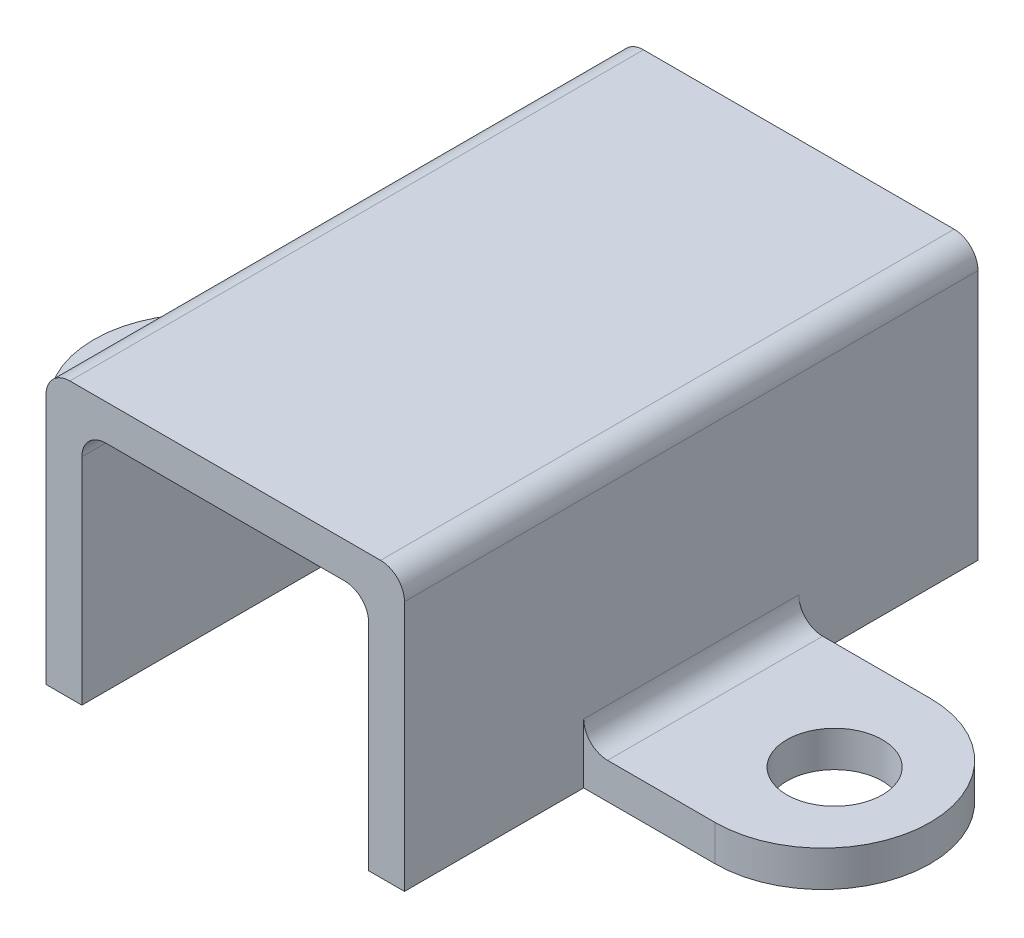
ISO-10303-21;
HEADER;
FILE_DESCRIPTION(('STEP AP214'),'2;1');
FILE_NAME('part.step','',(''),(''),'','','');
FILE_SCHEMA(('AUTOMOTIVE_DESIGN { 1 0 10303 214 1 1 1 1 }'));
ENDSEC;
DATA;
#1=APPLICATION_CONTEXT('core data for automotive mechanical design processes');
#2=APPLICATION_PROTOCOL_DEFINITION('international standard','automotive_design',2000,#1);
#3=PRODUCT_CONTEXT('',#1,'mechanical');
#4=PRODUCT('Part','Part','',(#3));
#5=PRODUCT_RELATED_PRODUCT_CATEGORY('part','',(#4));
#6=PRODUCT_DEFINITION_FORMATION('','',#4);
#7=PRODUCT_DEFINITION_CONTEXT('part definition',#1,'design');
#8=PRODUCT_DEFINITION('design','',#6,#7);
#9=PRODUCT_DEFINITION_SHAPE('','',#8);
#10=(LENGTH_UNIT() NAMED_UNIT(*) SI_UNIT(.MILLI.,.METRE.));
#11=(NAMED_UNIT(*) PLANE_ANGLE_UNIT() SI_UNIT($,.RADIAN.));
#12=(NAMED_UNIT(*) SI_UNIT($,.STERADIAN.) SOLID_ANGLE_UNIT());
#13=UNCERTAINTY_MEASURE_WITH_UNIT(LENGTH_MEASURE(1.E-05),#10,'distance_accuracy_value','');
#14=(GEOMETRIC_REPRESENTATION_CONTEXT(3) GLOBAL_UNCERTAINTY_ASSIGNED_CONTEXT((#13)) GLOBAL_UNIT_ASSIGNED_CONTEXT((#10,
#11,#12)) REPRESENTATION_CONTEXT('',''));
#15=CARTESIAN_POINT('',(0.,0.,0.));
#16=DIRECTION('',(0.,0.,1.));
#17=DIRECTION('',(1.,0.,0.));
#18=AXIS2_PLACEMENT_3D('',#15,#16,#17);
#19=CARTESIAN_POINT('',(6.5,-0.999999999999997,12.));
#20=DIRECTION('',(0.,0.,-1.));
#21=DIRECTION('',(-1.,0.,0.));
#22=AXIS2_PLACEMENT_3D('',#19,#20,#21);
#23=CYLINDRICAL_SURFACE('',#22,1.);
#24=DIRECTION('',(0.,0.,-1.));
#25=VECTOR('',#24,1.);
#26=CARTESIAN_POINT('',(6.5,0.,12.));
#27=LINE('',#26,#25);
#28=CARTESIAN_POINT('',(6.5,0.,12.));
#29=VERTEX_POINT('',#28);
#30=CARTESIAN_POINT('',(6.5,0.,-12.));
#31=VERTEX_POINT('',#30);
#32=EDGE_CURVE('E350',#29,#31,#27,.T.);
#33=ORIENTED_EDGE('',*,*,#32,.F.);
#34=CARTESIAN_POINT('',(6.5,-0.999999999999997,12.));
#35=DIRECTION('',(0.,0.,1.));
#36=DIRECTION('',(1.,0.,0.));
#37=AXIS2_PLACEMENT_3D('',#34,#35,#36);
#38=CIRCLE('',#37,1.);
#39=CARTESIAN_POINT('',(7.5,-0.999999999999997,12.));
#40=VERTEX_POINT('',#39);
#41=EDGE_CURVE('E64',#40,#29,#38,.T.);
#42=ORIENTED_EDGE('',*,*,#41,.F.);
#43=DIRECTION('',(0.,0.,-1.));
#44=VECTOR('',#43,1.);
#45=CARTESIAN_POINT('',(7.5,-0.999999999999997,12.));
#46=LINE('',#45,#44);
#47=CARTESIAN_POINT('',(7.5,-0.999999999999997,-12.));
#48=VERTEX_POINT('',#47);
#49=EDGE_CURVE('E353',#48,#40,#46,.F.);
#50=ORIENTED_EDGE('',*,*,#49,.F.);
#51=CARTESIAN_POINT('',(6.5,-0.999999999999997,-12.));
#52=DIRECTION('',(0.,0.,1.));
#53=DIRECTION('',(1.,0.,0.));
#54=AXIS2_PLACEMENT_3D('',#51,#52,#53);
#55=CIRCLE('',#54,1.);
#56=EDGE_CURVE('E12',#31,#48,#55,.F.);
#57=ORIENTED_EDGE('',*,*,#56,.F.);
#58=EDGE_LOOP('',(#33,#42,#50,#57));
#59=FACE_BOUND('',#58,.T.);
#60=ADVANCED_FACE('F57',(#59),#23,.T.);
#61=CARTESIAN_POINT('',(-6.5,-1.,12.));
#62=DIRECTION('',(0.,0.,1.));
#63=DIRECTION('',(1.,0.,0.));
#64=AXIS2_PLACEMENT_3D('',#61,#62,#63);
#65=CYLINDRICAL_SURFACE('',#64,1.);
#66=DIRECTION('',(0.,0.,1.));
#67=VECTOR('',#66,1.);
#68=CARTESIAN_POINT('',(-6.5,0.,12.));
#69=LINE('',#68,#67);
#70=CARTESIAN_POINT('',(-6.5,0.,-12.));
#71=VERTEX_POINT('',#70);
#72=CARTESIAN_POINT('',(-6.5,0.,12.));
#73=VERTEX_POINT('',#72);
#74=EDGE_CURVE('E339',#71,#73,#69,.T.);
#75=ORIENTED_EDGE('',*,*,#74,.F.);
#76=CARTESIAN_POINT('',(-6.5,-1.,-12.));
#77=DIRECTION('',(0.,0.,1.));
#78=DIRECTION('',(1.,0.,0.));
#79=AXIS2_PLACEMENT_3D('',#76,#77,#78);
#80=CIRCLE('',#79,1.);
#81=CARTESIAN_POINT('',(-7.5,-0.999999999999999,-12.));
#82=VERTEX_POINT('',#81);
#83=EDGE_CURVE('E345',#82,#71,#80,.F.);
#84=ORIENTED_EDGE('',*,*,#83,.F.);
#85=DIRECTION('',(0.,0.,1.));
#86=VECTOR('',#85,1.);
#87=CARTESIAN_POINT('',(-7.5,-0.999999999999999,12.));
#88=LINE('',#87,#86);
#89=CARTESIAN_POINT('',(-7.5,-0.999999999999999,12.));
#90=VERTEX_POINT('',#89);
#91=EDGE_CURVE('E342',#90,#82,#88,.F.);
#92=ORIENTED_EDGE('',*,*,#91,.F.);
#93=CARTESIAN_POINT('',(-6.5,-1.,12.));
#94=DIRECTION('',(0.,0.,1.));
#95=DIRECTION('',(1.,0.,0.));
#96=AXIS2_PLACEMENT_3D('',#93,#94,#95);
#97=CIRCLE('',#96,1.);
#98=EDGE_CURVE('E348',#73,#90,#97,.T.);
#99=ORIENTED_EDGE('',*,*,#98,.F.);
#100=EDGE_LOOP('',(#75,#84,#92,#99));
#101=FACE_BOUND('',#100,.T.);
#102=ADVANCED_FACE('F362',(#101),#65,.T.);
#103=CARTESIAN_POINT('',(5.,-2.5,12.));
#104=DIRECTION('',(0.,0.,-1.));
#105=DIRECTION('',(-1.,0.,0.));
#106=AXIS2_PLACEMENT_3D('',#103,#104,#105);
#107=CYLINDRICAL_SURFACE('',#106,1.);
#108=DIRECTION('',(0.,0.,1.));
#109=VECTOR('',#108,1.);
#110=CARTESIAN_POINT('',(5.,-1.5,12.));
#111=LINE('',#110,#109);
#112=CARTESIAN_POINT('',(5.,-1.5,-12.));
#113=VERTEX_POINT('',#112);
#114=CARTESIAN_POINT('',(5.,-1.5,12.));
#115=VERTEX_POINT('',#114);
#116=EDGE_CURVE('E329',#113,#115,#111,.T.);
#117=ORIENTED_EDGE('',*,*,#116,.F.);
#118=CARTESIAN_POINT('',(5.,-2.5,-12.));
#119=DIRECTION('',(0.,0.,1.));
#120=DIRECTION('',(1.,0.,0.));
#121=AXIS2_PLACEMENT_3D('',#118,#119,#120);
#122=CIRCLE('',#121,1.);
#123=CARTESIAN_POINT('',(6.,-2.5,-12.));
#124=VERTEX_POINT('',#123);
#125=EDGE_CURVE('E335',#113,#124,#122,.F.);
#126=ORIENTED_EDGE('',*,*,#125,.T.);
#127=DIRECTION('',(0.,0.,1.));
#128=VECTOR('',#127,1.);
#129=CARTESIAN_POINT('',(6.,-2.5,12.));
#130=LINE('',#129,#128);
#131=CARTESIAN_POINT('',(6.,-2.5,12.));
#132=VERTEX_POINT('',#131);
#133=EDGE_CURVE('E332',#132,#124,#130,.F.);
#134=ORIENTED_EDGE('',*,*,#133,.F.);
#135=CARTESIAN_POINT('',(5.,-2.5,12.));
#136=DIRECTION('',(0.,0.,1.));
#137=DIRECTION('',(1.,0.,0.));
#138=AXIS2_PLACEMENT_3D('',#135,#136,#137);
#139=CIRCLE('',#138,1.);
#140=EDGE_CURVE('E337',#132,#115,#139,.T.);
#141=ORIENTED_EDGE('',*,*,#140,.T.);
#142=EDGE_LOOP('',(#117,#126,#134,#141));
#143=FACE_BOUND('',#142,.T.);
#144=ADVANCED_FACE('F383',(#143),#107,.F.);
#145=CARTESIAN_POINT('',(-5.,-2.5,12.));
#146=DIRECTION('',(0.,0.,-1.));
#147=DIRECTION('',(-1.,0.,0.));
#148=AXIS2_PLACEMENT_3D('',#145,#146,#147);
#149=CYLINDRICAL_SURFACE('',#148,1.);
#150=DIRECTION('',(0.,0.,1.));
#151=VECTOR('',#150,1.);
#152=CARTESIAN_POINT('',(-6.,-2.5,12.));
#153=LINE('',#152,#151);
#154=CARTESIAN_POINT('',(-6.,-2.5,-12.));
#155=VERTEX_POINT('',#154);
#156=CARTESIAN_POINT('',(-6.,-2.5,12.));
#157=VERTEX_POINT('',#156);
#158=EDGE_CURVE('E319',#155,#157,#153,.T.);
#159=ORIENTED_EDGE('',*,*,#158,.F.);
#160=CARTESIAN_POINT('',(-5.,-2.5,-12.));
#161=DIRECTION('',(0.,0.,1.));
#162=DIRECTION('',(1.,0.,0.));
#163=AXIS2_PLACEMENT_3D('',#160,#161,#162);
#164=CIRCLE('',#163,1.);
#165=CARTESIAN_POINT('',(-5.,-1.5,-12.));
#166=VERTEX_POINT('',#165);
#167=EDGE_CURVE('E325',#155,#166,#164,.F.);
#168=ORIENTED_EDGE('',*,*,#167,.T.);
#169=DIRECTION('',(0.,0.,1.));
#170=VECTOR('',#169,1.);
#171=CARTESIAN_POINT('',(-5.,-1.5,12.));
#172=LINE('',#171,#170);
#173=CARTESIAN_POINT('',(-5.,-1.5,12.));
#174=VERTEX_POINT('',#173);
#175=EDGE_CURVE('E322',#174,#166,#172,.F.);
#176=ORIENTED_EDGE('',*,*,#175,.F.);
#177=CARTESIAN_POINT('',(-5.,-2.5,12.));
#178=DIRECTION('',(0.,0.,1.));
#179=DIRECTION('',(1.,0.,0.));
#180=AXIS2_PLACEMENT_3D('',#177,#178,#179);
#181=CIRCLE('',#180,1.);
#182=EDGE_CURVE('E327',#174,#157,#181,.T.);
#183=ORIENTED_EDGE('',*,*,#182,.T.);
#184=EDGE_LOOP('',(#159,#168,#176,#183));
#185=FACE_BOUND('',#184,.T.);
#186=ADVANCED_FACE('F377',(#185),#149,.F.);
#187=CARTESIAN_POINT('',(8.5,-9.,12.));
#188=DIRECTION('',(0.,0.,1.));
#189=DIRECTION('',(1.,0.,0.));
#190=AXIS2_PLACEMENT_3D('',#187,#188,#189);
#191=CYLINDRICAL_SURFACE('',#190,1.);
#192=DIRECTION('',(0.,0.,-1.));
#193=VECTOR('',#192,1.);
#194=CARTESIAN_POINT('',(7.5,-9.,12.));
#195=LINE('',#194,#193);
#196=CARTESIAN_POINT('',(7.5,-9.,4.5));
#197=VERTEX_POINT('',#196);
#198=CARTESIAN_POINT('',(7.5,-9.,-4.5));
#199=VERTEX_POINT('',#198);
#200=EDGE_CURVE('E308',#197,#199,#195,.T.);
#201=ORIENTED_EDGE('',*,*,#200,.F.);
#202=CARTESIAN_POINT('',(8.5,-9.,4.5));
#203=DIRECTION('',(0.,0.,1.));
#204=DIRECTION('',(1.,0.,0.));
#205=AXIS2_PLACEMENT_3D('',#202,#203,#204);
#206=CIRCLE('',#205,1.);
#207=CARTESIAN_POINT('',(8.5,-10.,4.5));
#208=VERTEX_POINT('',#207);
#209=EDGE_CURVE('E314',#197,#208,#206,.T.);
#210=ORIENTED_EDGE('',*,*,#209,.T.);
#211=DIRECTION('',(0.,0.,-1.));
#212=VECTOR('',#211,1.);
#213=CARTESIAN_POINT('',(8.5,-10.,12.));
#214=LINE('',#213,#212);
#215=CARTESIAN_POINT('',(8.5,-10.,-4.5));
#216=VERTEX_POINT('',#215);
#217=EDGE_CURVE('E311',#216,#208,#214,.F.);
#218=ORIENTED_EDGE('',*,*,#217,.F.);
#219=CARTESIAN_POINT('',(8.5,-9.,-4.5));
#220=DIRECTION('',(0.,0.,1.));
#221=DIRECTION('',(1.,0.,0.));
#222=AXIS2_PLACEMENT_3D('',#219,#220,#221);
#223=CIRCLE('',#222,1.);
#224=EDGE_CURVE('E316',#216,#199,#223,.F.);
#225=ORIENTED_EDGE('',*,*,#224,.T.);
#226=EDGE_LOOP('',(#201,#210,#218,#225));
#227=FACE_BOUND('',#226,.T.);
#228=ADVANCED_FACE('F451',(#227),#191,.F.);
#229=CARTESIAN_POINT('',(-8.5,-9.,12.));
#230=DIRECTION('',(0.,0.,-1.));
#231=DIRECTION('',(-1.,0.,0.));
#232=AXIS2_PLACEMENT_3D('',#229,#230,#231);
#233=CYLINDRICAL_SURFACE('',#232,1.);
#234=DIRECTION('',(0.,0.,1.));
#235=VECTOR('',#234,1.);
#236=CARTESIAN_POINT('',(-7.5,-9.,12.));
#237=LINE('',#236,#235);
#238=CARTESIAN_POINT('',(-7.5,-9.,-4.5));
#239=VERTEX_POINT('',#238);
#240=CARTESIAN_POINT('',(-7.5,-9.,4.5));
#241=VERTEX_POINT('',#240);
#242=EDGE_CURVE('E297',#239,#241,#237,.T.);
#243=ORIENTED_EDGE('',*,*,#242,.F.);
#244=CARTESIAN_POINT('',(-8.5,-9.,-4.5));
#245=DIRECTION('',(0.,0.,-1.));
#246=DIRECTION('',(-1.,0.,0.));
#247=AXIS2_PLACEMENT_3D('',#244,#245,#246);
#248=CIRCLE('',#247,1.);
#249=CARTESIAN_POINT('',(-8.5,-10.,-4.5));
#250=VERTEX_POINT('',#249);
#251=EDGE_CURVE('E303',#239,#250,#248,.T.);
#252=ORIENTED_EDGE('',*,*,#251,.T.);
#253=DIRECTION('',(0.,0.,1.));
#254=VECTOR('',#253,1.);
#255=CARTESIAN_POINT('',(-8.5,-10.,12.));
#256=LINE('',#255,#254);
#257=CARTESIAN_POINT('',(-8.5,-10.,4.5));
#258=VERTEX_POINT('',#257);
#259=EDGE_CURVE('E300',#258,#250,#256,.F.);
#260=ORIENTED_EDGE('',*,*,#259,.F.);
#261=CARTESIAN_POINT('',(-8.5,-9.,4.5));
#262=DIRECTION('',(0.,0.,1.));
#263=DIRECTION('',(1.,0.,0.));
#264=AXIS2_PLACEMENT_3D('',#261,#262,#263);
#265=CIRCLE('',#264,1.);
#266=EDGE_CURVE('E305',#258,#241,#265,.T.);
#267=ORIENTED_EDGE('',*,*,#266,.T.);
#268=EDGE_LOOP('',(#243,#252,#260,#267));
#269=FACE_BOUND('',#268,.T.);
#270=ADVANCED_FACE('F475',(#269),#233,.F.);
#271=CARTESIAN_POINT('',(-17.5,-10.,12.));
#272=DIRECTION('',(0.,-1.,0.));
#273=DIRECTION('',(0.,0.,-1.));
#274=AXIS2_PLACEMENT_3D('',#271,#272,#273);
#275=PLANE('',#274);
#276=CARTESIAN_POINT('',(-13.5,-10.,0.));
#277=DIRECTION('',(0.,1.,0.));
#278=DIRECTION('',(0.,0.,1.));
#279=AXIS2_PLACEMENT_3D('',#276,#277,#278);
#280=CIRCLE('',#279,2.);
#281=CARTESIAN_POINT('',(-13.5,-10.,2.));
#282=VERTEX_POINT('',#281);
#283=EDGE_CURVE('E431',#282,#282,#280,.T.);
#284=ORIENTED_EDGE('',*,*,#283,.F.);
#285=EDGE_LOOP('',(#284));
#286=FACE_BOUND('',#285,.T.);
#287=DIRECTION('',(1.,0.,0.));
#288=VECTOR('',#287,1.);
#289=CARTESIAN_POINT('',(0.,-10.,4.5));
#290=LINE('',#289,#288);
#291=CARTESIAN_POINT('',(-13.,-10.,4.5));
#292=VERTEX_POINT('',#291);
#293=EDGE_CURVE('E221',#292,#258,#290,.T.);
#294=ORIENTED_EDGE('',*,*,#293,.T.);
#295=ORIENTED_EDGE('',*,*,#259,.T.);
#296=DIRECTION('',(-1.,0.,0.));
#297=VECTOR('',#296,1.);
#298=CARTESIAN_POINT('',(0.,-10.,-4.5));
#299=LINE('',#298,#297);
#300=CARTESIAN_POINT('',(-13.,-10.,-4.5));
#301=VERTEX_POINT('',#300);
#302=EDGE_CURVE('E244',#250,#301,#299,.T.);
#303=ORIENTED_EDGE('',*,*,#302,.T.);
#304=CARTESIAN_POINT('',(-13.,-10.,0.));
#305=DIRECTION('',(0.,1.,0.));
#306=DIRECTION('',(0.,0.,1.));
#307=AXIS2_PLACEMENT_3D('',#304,#305,#306);
#308=CIRCLE('',#307,4.5);
#309=EDGE_CURVE('E214',#301,#292,#308,.T.);
#310=ORIENTED_EDGE('',*,*,#309,.T.);
#311=EDGE_LOOP('',(#294,#295,#303,#310));
#312=FACE_BOUND('',#311,.T.);
#313=ADVANCED_FACE('F477',(#286,#312),#275,.F.);
#314=CARTESIAN_POINT('',(-17.5,-11.5,12.));
#315=DIRECTION('',(0.,1.,0.));
#316=DIRECTION('',(0.,0.,1.));
#317=AXIS2_PLACEMENT_3D('',#314,#315,#316);
#318=PLANE('',#317);
#319=CARTESIAN_POINT('',(-13.5,-11.5,0.));
#320=DIRECTION('',(0.,1.,0.));
#321=DIRECTION('',(0.,0.,1.));
#322=AXIS2_PLACEMENT_3D('',#319,#320,#321);
#323=CIRCLE('',#322,2.);
#324=CARTESIAN_POINT('',(-13.5,-11.5,2.));
#325=VERTEX_POINT('',#324);
#326=EDGE_CURVE('E233',#325,#325,#323,.T.);
#327=ORIENTED_EDGE('',*,*,#326,.T.);
#328=EDGE_LOOP('',(#327));
#329=FACE_BOUND('',#328,.T.);
#330=DIRECTION('',(1.,0.,0.));
#331=VECTOR('',#330,1.);
#332=CARTESIAN_POINT('',(0.,-11.5,4.5));
#333=LINE('',#332,#331);
#334=CARTESIAN_POINT('',(-13.,-11.5,4.5));
#335=VERTEX_POINT('',#334);
#336=CARTESIAN_POINT('',(-7.5,-11.5,4.5));
#337=VERTEX_POINT('',#336);
#338=EDGE_CURVE('E218',#335,#337,#333,.T.);
#339=ORIENTED_EDGE('',*,*,#338,.F.);
#340=CARTESIAN_POINT('',(-13.,-11.5,0.));
#341=DIRECTION('',(0.,1.,0.));
#342=DIRECTION('',(0.,0.,1.));
#343=AXIS2_PLACEMENT_3D('',#340,#341,#342);
#344=CIRCLE('',#343,4.5);
#345=CARTESIAN_POINT('',(-13.,-11.5,-4.5));
#346=VERTEX_POINT('',#345);
#347=EDGE_CURVE('E202',#346,#335,#344,.T.);
#348=ORIENTED_EDGE('',*,*,#347,.F.);
#349=DIRECTION('',(-1.,0.,0.));
#350=VECTOR('',#349,1.);
#351=CARTESIAN_POINT('',(0.,-11.5,-4.5));
#352=LINE('',#351,#350);
#353=CARTESIAN_POINT('',(-7.5,-11.5,-4.5));
#354=VERTEX_POINT('',#353);
#355=EDGE_CURVE('E241',#354,#346,#352,.T.);
#356=ORIENTED_EDGE('',*,*,#355,.F.);
#357=DIRECTION('',(0.,0.,-1.));
#358=VECTOR('',#357,1.);
#359=CARTESIAN_POINT('',(-7.5,-11.5,0.));
#360=LINE('',#359,#358);
#361=CARTESIAN_POINT('',(-7.5,-11.5,-12.));
#362=VERTEX_POINT('',#361);
#363=EDGE_CURVE('E243',#354,#362,#360,.T.);
#364=ORIENTED_EDGE('',*,*,#363,.T.);
#365=DIRECTION('',(1.,0.,0.));
#366=VECTOR('',#365,1.);
#367=CARTESIAN_POINT('',(-17.5,-11.5,-12.));
#368=LINE('',#367,#366);
#369=CARTESIAN_POINT('',(-6.,-11.5,-12.));
#370=VERTEX_POINT('',#369);
#371=EDGE_CURVE('E280',#362,#370,#368,.T.);
#372=ORIENTED_EDGE('',*,*,#371,.T.);
#373=DIRECTION('',(0.,0.,-1.));
#374=VECTOR('',#373,1.);
#375=CARTESIAN_POINT('',(-6.,-11.5,12.));
#376=LINE('',#375,#374);
#377=CARTESIAN_POINT('',(-6.,-11.5,12.));
#378=VERTEX_POINT('',#377);
#379=EDGE_CURVE('E294',#378,#370,#376,.T.);
#380=ORIENTED_EDGE('',*,*,#379,.F.);
#381=DIRECTION('',(1.,0.,0.));
#382=VECTOR('',#381,1.);
#383=CARTESIAN_POINT('',(-17.5,-11.5,12.));
#384=LINE('',#383,#382);
#385=CARTESIAN_POINT('',(-7.5,-11.5,12.));
#386=VERTEX_POINT('',#385);
#387=EDGE_CURVE('E260',#386,#378,#384,.T.);
#388=ORIENTED_EDGE('',*,*,#387,.F.);
#389=DIRECTION('',(0.,0.,-1.));
#390=VECTOR('',#389,1.);
#391=CARTESIAN_POINT('',(-7.5,-11.5,0.));
#392=LINE('',#391,#390);
#393=EDGE_CURVE('E229',#386,#337,#392,.T.);
#394=ORIENTED_EDGE('',*,*,#393,.T.);
#395=EDGE_LOOP('',(#339,#348,#356,#364,#372,#380,#388,#394));
#396=FACE_BOUND('',#395,.T.);
#397=ADVANCED_FACE('F226',(#329,#396),#318,.F.);
#398=CARTESIAN_POINT('',(7.5,-10.,12.));
#399=DIRECTION('',(0.,-1.,0.));
#400=DIRECTION('',(0.,0.,-1.));
#401=AXIS2_PLACEMENT_3D('',#398,#399,#400);
#402=PLANE('',#401);
#403=CARTESIAN_POINT('',(13.5,-10.,0.));
#404=DIRECTION('',(0.,1.,0.));
#405=DIRECTION('',(0.,0.,1.));
#406=AXIS2_PLACEMENT_3D('',#403,#404,#405);
#407=CIRCLE('',#406,2.);
#408=CARTESIAN_POINT('',(13.5,-10.,2.));
#409=VERTEX_POINT('',#408);
#410=EDGE_CURVE('E437',#409,#409,#407,.T.);
#411=ORIENTED_EDGE('',*,*,#410,.F.);
#412=EDGE_LOOP('',(#411));
#413=FACE_BOUND('',#412,.T.);
#414=DIRECTION('',(1.,0.,0.));
#415=VECTOR('',#414,1.);
#416=CARTESIAN_POINT('',(0.,-10.,-4.5));
#417=LINE('',#416,#415);
#418=CARTESIAN_POINT('',(13.,-10.,-4.5));
#419=VERTEX_POINT('',#418);
#420=EDGE_CURVE('E404',#216,#419,#417,.T.);
#421=ORIENTED_EDGE('',*,*,#420,.F.);
#422=ORIENTED_EDGE('',*,*,#217,.T.);
#423=DIRECTION('',(1.,0.,0.));
#424=VECTOR('',#423,1.);
#425=CARTESIAN_POINT('',(0.,-10.,4.5));
#426=LINE('',#425,#424);
#427=CARTESIAN_POINT('',(13.,-10.,4.5));
#428=VERTEX_POINT('',#427);
#429=EDGE_CURVE('E240',#208,#428,#426,.T.);
#430=ORIENTED_EDGE('',*,*,#429,.T.);
#431=CARTESIAN_POINT('',(13.,-10.,0.));
#432=DIRECTION('',(0.,1.,0.));
#433=DIRECTION('',(0.,0.,1.));
#434=AXIS2_PLACEMENT_3D('',#431,#432,#433);
#435=CIRCLE('',#434,4.5);
#436=EDGE_CURVE('E222',#428,#419,#435,.T.);
#437=ORIENTED_EDGE('',*,*,#436,.T.);
#438=EDGE_LOOP('',(#421,#422,#430,#437));
#439=FACE_BOUND('',#438,.T.);
#440=ADVANCED_FACE('F412',(#413,#439),#402,.F.);
#441=CARTESIAN_POINT('',(6.,-11.5,12.));
#442=DIRECTION('',(0.,1.,0.));
#443=DIRECTION('',(0.,0.,1.));
#444=AXIS2_PLACEMENT_3D('',#441,#442,#443);
#445=PLANE('',#444);
#446=CARTESIAN_POINT('',(13.5,-11.5,0.));
#447=DIRECTION('',(0.,1.,0.));
#448=DIRECTION('',(0.,0.,1.));
#449=AXIS2_PLACEMENT_3D('',#446,#447,#448);
#450=CIRCLE('',#449,2.);
#451=CARTESIAN_POINT('',(13.5,-11.5,2.));
#452=VERTEX_POINT('',#451);
#453=EDGE_CURVE('E434',#452,#452,#450,.T.);
#454=ORIENTED_EDGE('',*,*,#453,.T.);
#455=EDGE_LOOP('',(#454));
#456=FACE_BOUND('',#455,.T.);
#457=DIRECTION('',(1.,0.,0.));
#458=VECTOR('',#457,1.);
#459=CARTESIAN_POINT('',(0.,-11.5,-4.5));
#460=LINE('',#459,#458);
#461=CARTESIAN_POINT('',(7.5,-11.5,-4.5));
#462=VERTEX_POINT('',#461);
#463=CARTESIAN_POINT('',(13.,-11.5,-4.5));
#464=VERTEX_POINT('',#463);
#465=EDGE_CURVE('E440',#462,#464,#460,.T.);
#466=ORIENTED_EDGE('',*,*,#465,.T.);
#467=CARTESIAN_POINT('',(13.,-11.5,0.));
#468=DIRECTION('',(0.,1.,0.));
#469=DIRECTION('',(0.,0.,1.));
#470=AXIS2_PLACEMENT_3D('',#467,#468,#469);
#471=CIRCLE('',#470,4.5);
#472=CARTESIAN_POINT('',(13.,-11.5,4.5));
#473=VERTEX_POINT('',#472);
#474=EDGE_CURVE('E422',#473,#464,#471,.T.);
#475=ORIENTED_EDGE('',*,*,#474,.F.);
#476=DIRECTION('',(1.,0.,0.));
#477=VECTOR('',#476,1.);
#478=CARTESIAN_POINT('',(0.,-11.5,4.5));
#479=LINE('',#478,#477);
#480=CARTESIAN_POINT('',(7.5,-11.5,4.5));
#481=VERTEX_POINT('',#480);
#482=EDGE_CURVE('E401',#481,#473,#479,.T.);
#483=ORIENTED_EDGE('',*,*,#482,.F.);
#484=DIRECTION('',(0.,0.,1.));
#485=VECTOR('',#484,1.);
#486=CARTESIAN_POINT('',(7.5,-11.5,0.));
#487=LINE('',#486,#485);
#488=CARTESIAN_POINT('',(7.5,-11.5,12.));
#489=VERTEX_POINT('',#488);
#490=EDGE_CURVE('E398',#481,#489,#487,.T.);
#491=ORIENTED_EDGE('',*,*,#490,.T.);
#492=DIRECTION('',(1.,0.,0.));
#493=VECTOR('',#492,1.);
#494=CARTESIAN_POINT('',(6.,-11.5,12.));
#495=LINE('',#494,#493);
#496=CARTESIAN_POINT('',(6.,-11.5,12.));
#497=VERTEX_POINT('',#496);
#498=EDGE_CURVE('E270',#497,#489,#495,.T.);
#499=ORIENTED_EDGE('',*,*,#498,.F.);
#500=DIRECTION('',(0.,0.,-1.));
#501=VECTOR('',#500,1.);
#502=CARTESIAN_POINT('',(6.,-11.5,12.));
#503=LINE('',#502,#501);
#504=CARTESIAN_POINT('',(6.,-11.5,-12.));
#505=VERTEX_POINT('',#504);
#506=EDGE_CURVE('E273',#497,#505,#503,.T.);
#507=ORIENTED_EDGE('',*,*,#506,.T.);
#508=DIRECTION('',(1.,0.,0.));
#509=VECTOR('',#508,1.);
#510=CARTESIAN_POINT('',(6.,-11.5,-12.));
#511=LINE('',#510,#509);
#512=CARTESIAN_POINT('',(7.5,-11.5,-12.));
#513=VERTEX_POINT('',#512);
#514=EDGE_CURVE('E256',#505,#513,#511,.T.);
#515=ORIENTED_EDGE('',*,*,#514,.T.);
#516=DIRECTION('',(0.,0.,-1.));
#517=VECTOR('',#516,1.);
#518=CARTESIAN_POINT('',(7.5,-11.5,0.));
#519=LINE('',#518,#517);
#520=EDGE_CURVE('E442',#462,#513,#519,.T.);
#521=ORIENTED_EDGE('',*,*,#520,.F.);
#522=EDGE_LOOP('',(#466,#475,#483,#491,#499,#507,#515,#521));
#523=FACE_BOUND('',#522,.T.);
#524=ADVANCED_FACE('F395',(#456,#523),#445,.F.);
#525=CARTESIAN_POINT('',(0.,-11.5,-4.5));
#526=DIRECTION('',(0.,0.,1.));
#527=DIRECTION('',(1.,0.,0.));
#528=AXIS2_PLACEMENT_3D('',#525,#526,#527);
#529=PLANE('',#528);
#530=DIRECTION('',(0.,1.,0.));
#531=VECTOR('',#530,1.);
#532=CARTESIAN_POINT('',(13.,-11.5,-4.5));
#533=LINE('',#532,#531);
#534=EDGE_CURVE('E223',#464,#419,#533,.T.);
#535=ORIENTED_EDGE('',*,*,#534,.F.);
#536=ORIENTED_EDGE('',*,*,#465,.F.);
#537=DIRECTION('',(0.,1.,0.));
#538=VECTOR('',#537,1.);
#539=CARTESIAN_POINT('',(7.5,-11.5,-4.5));
#540=LINE('',#539,#538);
#541=EDGE_CURVE('E249',#462,#199,#540,.T.);
#542=ORIENTED_EDGE('',*,*,#541,.T.);
#543=ORIENTED_EDGE('',*,*,#224,.F.);
#544=ORIENTED_EDGE('',*,*,#420,.T.);
#545=EDGE_LOOP('',(#535,#536,#542,#543,#544));
#546=FACE_BOUND('',#545,.T.);
#547=ADVANCED_FACE('F447',(#546),#529,.F.);
#548=CARTESIAN_POINT('',(0.,-11.5,-4.5));
#549=DIRECTION('',(0.,0.,-1.));
#550=DIRECTION('',(-1.,0.,0.));
#551=AXIS2_PLACEMENT_3D('',#548,#549,#550);
#552=PLANE('',#551);
#553=ORIENTED_EDGE('',*,*,#355,.T.);
#554=DIRECTION('',(0.,1.,0.));
#555=VECTOR('',#554,1.);
#556=CARTESIAN_POINT('',(-13.,-11.5,-4.5));
#557=LINE('',#556,#555);
#558=EDGE_CURVE('E209',#346,#301,#557,.T.);
#559=ORIENTED_EDGE('',*,*,#558,.T.);
#560=ORIENTED_EDGE('',*,*,#302,.F.);
#561=ORIENTED_EDGE('',*,*,#251,.F.);
#562=DIRECTION('',(0.,1.,0.));
#563=VECTOR('',#562,1.);
#564=CARTESIAN_POINT('',(-7.5,-11.5,-4.5));
#565=LINE('',#564,#563);
#566=EDGE_CURVE('E247',#354,#239,#565,.T.);
#567=ORIENTED_EDGE('',*,*,#566,.F.);
#568=EDGE_LOOP('',(#553,#559,#560,#561,#567));
#569=FACE_BOUND('',#568,.T.);
#570=ADVANCED_FACE('F490',(#569),#552,.T.);
#571=CARTESIAN_POINT('',(0.,-11.5,4.5));
#572=DIRECTION('',(0.,0.,1.));
#573=DIRECTION('',(1.,0.,0.));
#574=AXIS2_PLACEMENT_3D('',#571,#572,#573);
#575=PLANE('',#574);
#576=ORIENTED_EDGE('',*,*,#482,.T.);
#577=DIRECTION('',(0.,1.,0.));
#578=VECTOR('',#577,1.);
#579=CARTESIAN_POINT('',(13.,-11.5,4.5));
#580=LINE('',#579,#578);
#581=EDGE_CURVE('E420',#473,#428,#580,.T.);
#582=ORIENTED_EDGE('',*,*,#581,.T.);
#583=ORIENTED_EDGE('',*,*,#429,.F.);
#584=ORIENTED_EDGE('',*,*,#209,.F.);
#585=DIRECTION('',(0.,1.,0.));
#586=VECTOR('',#585,1.);
#587=CARTESIAN_POINT('',(7.5,-11.5,4.5));
#588=LINE('',#587,#586);
#589=EDGE_CURVE('E236',#481,#197,#588,.T.);
#590=ORIENTED_EDGE('',*,*,#589,.F.);
#591=EDGE_LOOP('',(#576,#582,#583,#584,#590));
#592=FACE_BOUND('',#591,.T.);
#593=ADVANCED_FACE('F424',(#592),#575,.T.);
#594=CARTESIAN_POINT('',(0.,0.,-12.));
#595=DIRECTION('',(0.,0.,1.));
#596=DIRECTION('',(1.,0.,0.));
#597=AXIS2_PLACEMENT_3D('',#594,#595,#596);
#598=PLANE('',#597);
#599=DIRECTION('',(-1.,0.,0.));
#600=VECTOR('',#599,1.);
#601=CARTESIAN_POINT('',(-7.5,0.,-12.));
#602=LINE('',#601,#600);
#603=EDGE_CURVE('E276',#31,#71,#602,.T.);
#604=ORIENTED_EDGE('',*,*,#603,.F.);
#605=ORIENTED_EDGE('',*,*,#56,.T.);
#606=DIRECTION('',(0.,1.,0.));
#607=VECTOR('',#606,1.);
#608=CARTESIAN_POINT('',(7.5,0.,-12.));
#609=LINE('',#608,#607);
#610=EDGE_CURVE('E251',#513,#48,#609,.T.);
#611=ORIENTED_EDGE('',*,*,#610,.F.);
#612=ORIENTED_EDGE('',*,*,#514,.F.);
#613=DIRECTION('',(0.,-1.,0.));
#614=VECTOR('',#613,1.);
#615=CARTESIAN_POINT('',(6.,-1.5,-12.));
#616=LINE('',#615,#614);
#617=EDGE_CURVE('E288',#124,#505,#616,.T.);
#618=ORIENTED_EDGE('',*,*,#617,.F.);
#619=ORIENTED_EDGE('',*,*,#125,.F.);
#620=DIRECTION('',(1.,0.,0.));
#621=VECTOR('',#620,1.);
#622=CARTESIAN_POINT('',(-6.,-1.5,-12.));
#623=LINE('',#622,#621);
#624=EDGE_CURVE('E285',#166,#113,#623,.T.);
#625=ORIENTED_EDGE('',*,*,#624,.F.);
#626=ORIENTED_EDGE('',*,*,#167,.F.);
#627=DIRECTION('',(0.,1.,0.));
#628=VECTOR('',#627,1.);
#629=CARTESIAN_POINT('',(-6.,-11.5,-12.));
#630=LINE('',#629,#628);
#631=EDGE_CURVE('E282',#370,#155,#630,.T.);
#632=ORIENTED_EDGE('',*,*,#631,.F.);
#633=ORIENTED_EDGE('',*,*,#371,.F.);
#634=DIRECTION('',(0.,-1.,0.));
#635=VECTOR('',#634,1.);
#636=CARTESIAN_POINT('',(-7.5,-10.,-12.));
#637=LINE('',#636,#635);
#638=EDGE_CURVE('E278',#82,#362,#637,.T.);
#639=ORIENTED_EDGE('',*,*,#638,.F.);
#640=ORIENTED_EDGE('',*,*,#83,.T.);
#641=EDGE_LOOP('',(#604,#605,#611,#612,#618,#619,#625,#626,#632,#633,#639,#640));
#642=FACE_BOUND('',#641,.T.);
#643=ADVANCED_FACE('F454',(#642),#598,.F.);
#644=CARTESIAN_POINT('',(7.5,0.,12.));
#645=DIRECTION('',(-1.,0.,0.));
#646=DIRECTION('',(0.,-1.,0.));
#647=AXIS2_PLACEMENT_3D('',#644,#645,#646);
#648=PLANE('',#647);
#649=ORIENTED_EDGE('',*,*,#610,.T.);
#650=ORIENTED_EDGE('',*,*,#49,.T.);
#651=DIRECTION('',(0.,1.,0.));
#652=VECTOR('',#651,1.);
#653=CARTESIAN_POINT('',(7.5,0.,12.));
#654=LINE('',#653,#652);
#655=EDGE_CURVE('E252',#489,#40,#654,.T.);
#656=ORIENTED_EDGE('',*,*,#655,.F.);
#657=ORIENTED_EDGE('',*,*,#490,.F.);
#658=ORIENTED_EDGE('',*,*,#589,.T.);
#659=ORIENTED_EDGE('',*,*,#200,.T.);
#660=ORIENTED_EDGE('',*,*,#541,.F.);
#661=ORIENTED_EDGE('',*,*,#520,.T.);
#662=EDGE_LOOP('',(#649,#650,#656,#657,#658,#659,#660,#661));
#663=FACE_BOUND('',#662,.T.);
#664=ADVANCED_FACE('F452',(#663),#648,.F.);
#665=CARTESIAN_POINT('',(-7.5,0.,12.));
#666=DIRECTION('',(0.,-1.,0.));
#667=DIRECTION('',(1.,0.,0.));
#668=AXIS2_PLACEMENT_3D('',#665,#666,#667);
#669=PLANE('',#668);
#670=DIRECTION('',(-1.,0.,0.));
#671=VECTOR('',#670,1.);
#672=CARTESIAN_POINT('',(-7.5,0.,12.));
#673=LINE('',#672,#671);
#674=EDGE_CURVE('E255',#29,#73,#673,.T.);
#675=ORIENTED_EDGE('',*,*,#674,.F.);
#676=ORIENTED_EDGE('',*,*,#32,.T.);
#677=ORIENTED_EDGE('',*,*,#603,.T.);
#678=ORIENTED_EDGE('',*,*,#74,.T.);
#679=EDGE_LOOP('',(#675,#676,#677,#678));
#680=FACE_BOUND('',#679,.T.);
#681=ADVANCED_FACE('F359',(#680),#669,.F.);
#682=CARTESIAN_POINT('',(-7.5,-10.,12.));
#683=DIRECTION('',(1.,0.,0.));
#684=DIRECTION('',(0.,0.,-1.));
#685=AXIS2_PLACEMENT_3D('',#682,#683,#684);
#686=PLANE('',#685);
#687=DIRECTION('',(0.,-1.,0.));
#688=VECTOR('',#687,1.);
#689=CARTESIAN_POINT('',(-7.5,-10.,12.));
#690=LINE('',#689,#688);
#691=EDGE_CURVE('E258',#90,#386,#690,.T.);
#692=ORIENTED_EDGE('',*,*,#691,.F.);
#693=ORIENTED_EDGE('',*,*,#91,.T.);
#694=ORIENTED_EDGE('',*,*,#638,.T.);
#695=ORIENTED_EDGE('',*,*,#363,.F.);
#696=ORIENTED_EDGE('',*,*,#566,.T.);
#697=ORIENTED_EDGE('',*,*,#242,.T.);
#698=DIRECTION('',(0.,1.,0.));
#699=VECTOR('',#698,1.);
#700=CARTESIAN_POINT('',(-7.5,-11.5,4.5));
#701=LINE('',#700,#699);
#702=EDGE_CURVE('E231',#337,#241,#701,.T.);
#703=ORIENTED_EDGE('',*,*,#702,.F.);
#704=ORIENTED_EDGE('',*,*,#393,.F.);
#705=EDGE_LOOP('',(#692,#693,#694,#695,#696,#697,#703,#704));
#706=FACE_BOUND('',#705,.T.);
#707=ADVANCED_FACE('F367',(#706),#686,.F.);
#708=CARTESIAN_POINT('',(-6.,-11.5,12.));
#709=DIRECTION('',(-1.,0.,0.));
#710=DIRECTION('',(0.,0.,1.));
#711=AXIS2_PLACEMENT_3D('',#708,#709,#710);
#712=PLANE('',#711);
#713=ORIENTED_EDGE('',*,*,#631,.T.);
#714=ORIENTED_EDGE('',*,*,#158,.T.);
#715=DIRECTION('',(0.,1.,0.));
#716=VECTOR('',#715,1.);
#717=CARTESIAN_POINT('',(-6.,-11.5,12.));
#718=LINE('',#717,#716);
#719=EDGE_CURVE('E262',#378,#157,#718,.T.);
#720=ORIENTED_EDGE('',*,*,#719,.F.);
#721=ORIENTED_EDGE('',*,*,#379,.T.);
#722=EDGE_LOOP('',(#713,#714,#720,#721));
#723=FACE_BOUND('',#722,.T.);
#724=ADVANCED_FACE('F372',(#723),#712,.F.);
#725=CARTESIAN_POINT('',(-6.,-1.5,12.));
#726=DIRECTION('',(0.,1.,0.));
#727=DIRECTION('',(0.,0.,1.));
#728=AXIS2_PLACEMENT_3D('',#725,#726,#727);
#729=PLANE('',#728);
#730=ORIENTED_EDGE('',*,*,#624,.T.);
#731=ORIENTED_EDGE('',*,*,#116,.T.);
#732=DIRECTION('',(1.,0.,0.));
#733=VECTOR('',#732,1.);
#734=CARTESIAN_POINT('',(-6.,-1.5,12.));
#735=LINE('',#734,#733);
#736=EDGE_CURVE('E265',#174,#115,#735,.T.);
#737=ORIENTED_EDGE('',*,*,#736,.F.);
#738=ORIENTED_EDGE('',*,*,#175,.T.);
#739=EDGE_LOOP('',(#730,#731,#737,#738));
#740=FACE_BOUND('',#739,.T.);
#741=ADVANCED_FACE('F380',(#740),#729,.F.);
#742=CARTESIAN_POINT('',(6.,-1.5,12.));
#743=DIRECTION('',(1.,0.,0.));
#744=DIRECTION('',(0.,1.,0.));
#745=AXIS2_PLACEMENT_3D('',#742,#743,#744);
#746=PLANE('',#745);
#747=DIRECTION('',(0.,-1.,0.));
#748=VECTOR('',#747,1.);
#749=CARTESIAN_POINT('',(6.,-1.5,12.));
#750=LINE('',#749,#748);
#751=EDGE_CURVE('E268',#132,#497,#750,.T.);
#752=ORIENTED_EDGE('',*,*,#751,.F.);
#753=ORIENTED_EDGE('',*,*,#133,.T.);
#754=ORIENTED_EDGE('',*,*,#617,.T.);
#755=ORIENTED_EDGE('',*,*,#506,.F.);
#756=EDGE_LOOP('',(#752,#753,#754,#755));
#757=FACE_BOUND('',#756,.T.);
#758=ADVANCED_FACE('F389',(#757),#746,.F.);
#759=CARTESIAN_POINT('',(0.,0.,12.));
#760=DIRECTION('',(0.,0.,1.));
#761=DIRECTION('',(1.,0.,0.));
#762=AXIS2_PLACEMENT_3D('',#759,#760,#761);
#763=PLANE('',#762);
#764=ORIENTED_EDGE('',*,*,#655,.T.);
#765=ORIENTED_EDGE('',*,*,#41,.T.);
#766=ORIENTED_EDGE('',*,*,#674,.T.);
#767=ORIENTED_EDGE('',*,*,#98,.T.);
#768=ORIENTED_EDGE('',*,*,#691,.T.);
#769=ORIENTED_EDGE('',*,*,#387,.T.);
#770=ORIENTED_EDGE('',*,*,#719,.T.);
#771=ORIENTED_EDGE('',*,*,#182,.F.);
#772=ORIENTED_EDGE('',*,*,#736,.T.);
#773=ORIENTED_EDGE('',*,*,#140,.F.);
#774=ORIENTED_EDGE('',*,*,#751,.T.);
#775=ORIENTED_EDGE('',*,*,#498,.T.);
#776=EDGE_LOOP('',(#764,#765,#766,#767,#768,#769,#770,#771,#772,#773,#774,#775));
#777=FACE_BOUND('',#776,.T.);
#778=ADVANCED_FACE('F355',(#777),#763,.T.);
#779=CARTESIAN_POINT('',(0.,-11.5,4.5));
#780=DIRECTION('',(0.,0.,1.));
#781=DIRECTION('',(1.,0.,0.));
#782=AXIS2_PLACEMENT_3D('',#779,#780,#781);
#783=PLANE('',#782);
#784=DIRECTION('',(0.,1.,0.));
#785=VECTOR('',#784,1.);
#786=CARTESIAN_POINT('',(-13.,-11.5,4.5));
#787=LINE('',#786,#785);
#788=EDGE_CURVE('E206',#335,#292,#787,.T.);
#789=ORIENTED_EDGE('',*,*,#788,.F.);
#790=ORIENTED_EDGE('',*,*,#338,.T.);
#791=ORIENTED_EDGE('',*,*,#702,.T.);
#792=ORIENTED_EDGE('',*,*,#266,.F.);
#793=ORIENTED_EDGE('',*,*,#293,.F.);
#794=EDGE_LOOP('',(#789,#790,#791,#792,#793));
#795=FACE_BOUND('',#794,.T.);
#796=ADVANCED_FACE('F217',(#795),#783,.T.);
#797=CARTESIAN_POINT('',(13.5,-11.5,0.));
#798=DIRECTION('',(0.,1.,0.));
#799=DIRECTION('',(0.,0.,1.));
#800=AXIS2_PLACEMENT_3D('',#797,#798,#799);
#801=CYLINDRICAL_SURFACE('',#800,2.);
#802=ORIENTED_EDGE('',*,*,#453,.F.);
#803=EDGE_LOOP('',(#802));
#804=FACE_BOUND('',#803,.T.);
#805=ORIENTED_EDGE('',*,*,#410,.T.);
#806=EDGE_LOOP('',(#805));
#807=FACE_BOUND('',#806,.T.);
#808=ADVANCED_FACE('F551',(#804,#807),#801,.F.);
#809=CARTESIAN_POINT('',(-13.5,-11.5,0.));
#810=DIRECTION('',(0.,1.,0.));
#811=DIRECTION('',(0.,0.,1.));
#812=AXIS2_PLACEMENT_3D('',#809,#810,#811);
#813=CYLINDRICAL_SURFACE('',#812,2.);
#814=ORIENTED_EDGE('',*,*,#326,.F.);
#815=EDGE_LOOP('',(#814));
#816=FACE_BOUND('',#815,.T.);
#817=ORIENTED_EDGE('',*,*,#283,.T.);
#818=EDGE_LOOP('',(#817));
#819=FACE_BOUND('',#818,.T.);
#820=ADVANCED_FACE('F558',(#816,#819),#813,.F.);
#821=CARTESIAN_POINT('',(13.,-11.5,0.));
#822=DIRECTION('',(0.,1.,0.));
#823=DIRECTION('',(0.,0.,1.));
#824=AXIS2_PLACEMENT_3D('',#821,#822,#823);
#825=CYLINDRICAL_SURFACE('',#824,4.5);
#826=ORIENTED_EDGE('',*,*,#436,.F.);
#827=ORIENTED_EDGE('',*,*,#581,.F.);
#828=ORIENTED_EDGE('',*,*,#474,.T.);
#829=ORIENTED_EDGE('',*,*,#534,.T.);
#830=EDGE_LOOP('',(#826,#827,#828,#829));
#831=FACE_BOUND('',#830,.T.);
#832=ADVANCED_FACE('F419',(#831),#825,.T.);
#833=CARTESIAN_POINT('',(-13.,-11.5,0.));
#834=DIRECTION('',(0.,1.,0.));
#835=DIRECTION('',(0.,0.,1.));
#836=AXIS2_PLACEMENT_3D('',#833,#834,#835);
#837=CYLINDRICAL_SURFACE('',#836,4.5);
#838=ORIENTED_EDGE('',*,*,#309,.F.);
#839=ORIENTED_EDGE('',*,*,#558,.F.);
#840=ORIENTED_EDGE('',*,*,#347,.T.);
#841=ORIENTED_EDGE('',*,*,#788,.T.);
#842=EDGE_LOOP('',(#838,#839,#840,#841));
#843=FACE_BOUND('',#842,.T.);
#844=ADVANCED_FACE('F205',(#843),#837,.T.);
#845=CLOSED_SHELL('',(#60,#102,#144,#186,#228,#270,#313,#397,#440,#524,#547,#570,#593,#643,#664,
#681,#707,#724,#741,#758,#778,#796,#808,#820,#832,#844));
#846=MANIFOLD_SOLID_BREP('B2',#845);
#847=ADVANCED_BREP_SHAPE_REPRESENTATION('',(#18,#846),#14);
#848=SHAPE_DEFINITION_REPRESENTATION(#9,#847);
ENDSEC;
END-ISO-10303-21;
